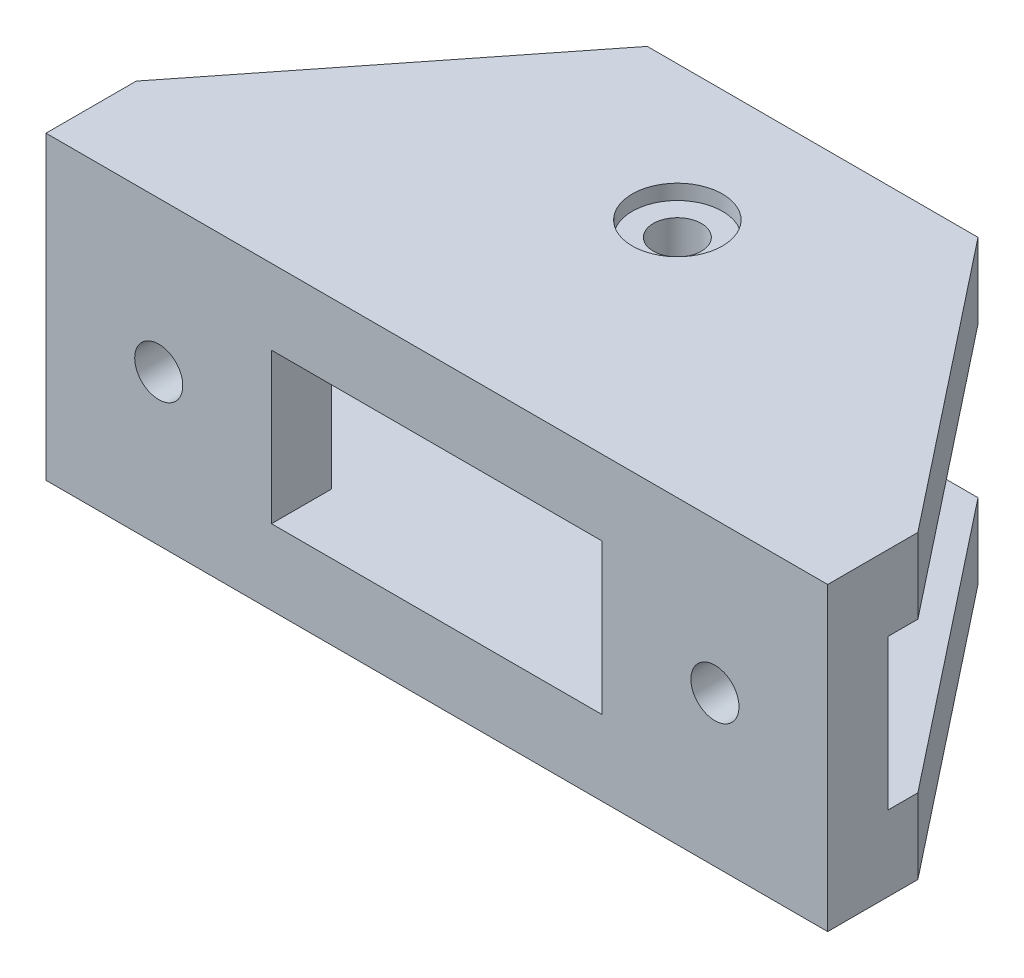
ISO-10303-21;
HEADER;
FILE_DESCRIPTION(('STEP AP214'),'2;1');
FILE_NAME('part.step','',(''),(''),'','','');
FILE_SCHEMA(('AUTOMOTIVE_DESIGN { 1 0 10303 214 1 1 1 1 }'));
ENDSEC;
DATA;
#1=APPLICATION_CONTEXT('core data for automotive mechanical design processes');
#2=APPLICATION_PROTOCOL_DEFINITION('international standard','automotive_design',2000,#1);
#3=PRODUCT_CONTEXT('',#1,'mechanical');
#4=PRODUCT('Part','Part','',(#3));
#5=PRODUCT_RELATED_PRODUCT_CATEGORY('part','',(#4));
#6=PRODUCT_DEFINITION_FORMATION('','',#4);
#7=PRODUCT_DEFINITION_CONTEXT('part definition',#1,'design');
#8=PRODUCT_DEFINITION('design','',#6,#7);
#9=PRODUCT_DEFINITION_SHAPE('','',#8);
#10=(LENGTH_UNIT() NAMED_UNIT(*) SI_UNIT(.MILLI.,.METRE.));
#11=(NAMED_UNIT(*) PLANE_ANGLE_UNIT() SI_UNIT($,.RADIAN.));
#12=(NAMED_UNIT(*) SI_UNIT($,.STERADIAN.) SOLID_ANGLE_UNIT());
#13=UNCERTAINTY_MEASURE_WITH_UNIT(LENGTH_MEASURE(1.E-05),#10,'distance_accuracy_value','');
#14=(GEOMETRIC_REPRESENTATION_CONTEXT(3) GLOBAL_UNCERTAINTY_ASSIGNED_CONTEXT((#13)) GLOBAL_UNIT_ASSIGNED_CONTEXT((#10,
#11,#12)) REPRESENTATION_CONTEXT('',''));
#15=CARTESIAN_POINT('',(0.,0.,0.));
#16=DIRECTION('',(0.,0.,1.));
#17=DIRECTION('',(1.,0.,0.));
#18=AXIS2_PLACEMENT_3D('',#15,#16,#17);
#19=CARTESIAN_POINT('',(514.530256366169,120.470120326647,9.));
#20=DIRECTION('',(0.,1.,0.));
#21=DIRECTION('',(0.,0.,1.));
#22=AXIS2_PLACEMENT_3D('',#19,#20,#21);
#23=CYLINDRICAL_SURFACE('',#22,1.60000000000002);
#24=CARTESIAN_POINT('',(514.530256366169,135.470120326647,9.));
#25=DIRECTION('',(0.,1.,0.));
#26=DIRECTION('',(0.,0.,1.));
#27=AXIS2_PLACEMENT_3D('',#24,#25,#26);
#28=CIRCLE('',#27,1.60000000000002);
#29=CARTESIAN_POINT('',(514.530256366169,135.470120326647,10.6));
#30=VERTEX_POINT('',#29);
#31=EDGE_CURVE('E351',#30,#30,#28,.T.);
#32=ORIENTED_EDGE('',*,*,#31,.F.);
#33=EDGE_LOOP('',(#32));
#34=FACE_BOUND('',#33,.T.);
#35=CARTESIAN_POINT('',(514.530256366169,139.470120326647,9.));
#36=DIRECTION('',(0.,1.,0.));
#37=DIRECTION('',(0.,0.,1.));
#38=AXIS2_PLACEMENT_3D('',#35,#36,#37);
#39=CIRCLE('',#38,1.60000000000002);
#40=CARTESIAN_POINT('',(514.530256366169,139.470120326647,10.6));
#41=VERTEX_POINT('',#40);
#42=EDGE_CURVE('E45',#41,#41,#39,.F.);
#43=ORIENTED_EDGE('',*,*,#42,.F.);
#44=EDGE_LOOP('',(#43));
#45=FACE_BOUND('',#44,.T.);
#46=ADVANCED_FACE('F41',(#34,#45),#23,.F.);
#47=CARTESIAN_POINT('',(533.030256366169,130.470120326647,25.));
#48=DIRECTION('',(0.,0.,-1.));
#49=DIRECTION('',(-1.,0.,0.));
#50=AXIS2_PLACEMENT_3D('',#47,#48,#49);
#51=CYLINDRICAL_SURFACE('',#50,1.60000000000002);
#52=CARTESIAN_POINT('',(533.030256366169,130.470120326647,25.));
#53=DIRECTION('',(0.,0.,-1.));
#54=DIRECTION('',(-1.,0.,0.));
#55=AXIS2_PLACEMENT_3D('',#52,#53,#54);
#56=CIRCLE('',#55,1.60000000000002);
#57=CARTESIAN_POINT('',(531.430256366169,130.470120326647,25.));
#58=VERTEX_POINT('',#57);
#59=EDGE_CURVE('E303',#58,#58,#56,.T.);
#60=ORIENTED_EDGE('',*,*,#59,.F.);
#61=EDGE_LOOP('',(#60));
#62=FACE_BOUND('',#61,.T.);
#63=CARTESIAN_POINT('',(533.030256366169,130.470120326647,22.));
#64=DIRECTION('',(0.,0.,-1.));
#65=DIRECTION('',(-1.,0.,0.));
#66=AXIS2_PLACEMENT_3D('',#63,#64,#65);
#67=CIRCLE('',#66,1.60000000000002);
#68=CARTESIAN_POINT('',(531.430256366169,130.470120326647,22.));
#69=VERTEX_POINT('',#68);
#70=EDGE_CURVE('E254',#69,#69,#67,.F.);
#71=ORIENTED_EDGE('',*,*,#70,.F.);
#72=EDGE_LOOP('',(#71));
#73=FACE_BOUND('',#72,.T.);
#74=ADVANCED_FACE('F486',(#62,#73),#51,.F.);
#75=CARTESIAN_POINT('',(496.030256366169,130.470120326647,25.));
#76=DIRECTION('',(0.,0.,-1.));
#77=DIRECTION('',(-1.,0.,0.));
#78=AXIS2_PLACEMENT_3D('',#75,#76,#77);
#79=CYLINDRICAL_SURFACE('',#78,1.59999999999996);
#80=CARTESIAN_POINT('',(496.030256366169,130.470120326647,25.));
#81=DIRECTION('',(0.,0.,-1.));
#82=DIRECTION('',(-1.,0.,0.));
#83=AXIS2_PLACEMENT_3D('',#80,#81,#82);
#84=CIRCLE('',#83,1.59999999999996);
#85=CARTESIAN_POINT('',(494.430256366169,130.470120326647,25.));
#86=VERTEX_POINT('',#85);
#87=EDGE_CURVE('E308',#86,#86,#84,.T.);
#88=ORIENTED_EDGE('',*,*,#87,.F.);
#89=EDGE_LOOP('',(#88));
#90=FACE_BOUND('',#89,.T.);
#91=CARTESIAN_POINT('',(496.030256366169,130.470120326647,22.));
#92=DIRECTION('',(0.,0.,-1.));
#93=DIRECTION('',(-1.,0.,0.));
#94=AXIS2_PLACEMENT_3D('',#91,#92,#93);
#95=CIRCLE('',#94,1.59999999999996);
#96=CARTESIAN_POINT('',(494.430256366169,130.470120326647,22.));
#97=VERTEX_POINT('',#96);
#98=EDGE_CURVE('E294',#97,#97,#95,.F.);
#99=ORIENTED_EDGE('',*,*,#98,.F.);
#100=EDGE_LOOP('',(#99));
#101=FACE_BOUND('',#100,.T.);
#102=ADVANCED_FACE('F488',(#90,#101),#79,.F.);
#103=CARTESIAN_POINT('',(488.530256366169,135.470120326647,21.));
#104=DIRECTION('',(0.,0.,1.));
#105=DIRECTION('',(1.,0.,0.));
#106=AXIS2_PLACEMENT_3D('',#103,#104,#105);
#107=PLANE('',#106);
#108=DIRECTION('',(-1.,0.,0.));
#109=VECTOR('',#108,1.);
#110=CARTESIAN_POINT('',(536.030256366169,126.970120326647,21.));
#111=LINE('',#110,#109);
#112=CARTESIAN_POINT('',(536.030256366169,126.970120326647,21.));
#113=VERTEX_POINT('',#112);
#114=CARTESIAN_POINT('',(530.030256366169,126.970120326647,21.));
#115=VERTEX_POINT('',#114);
#116=EDGE_CURVE('E245',#113,#115,#111,.T.);
#117=ORIENTED_EDGE('',*,*,#116,.F.);
#118=DIRECTION('',(0.,-1.,0.));
#119=VECTOR('',#118,1.);
#120=CARTESIAN_POINT('',(536.030256366169,133.970120326647,21.));
#121=LINE('',#120,#119);
#122=CARTESIAN_POINT('',(536.030256366169,133.970120326647,21.));
#123=VERTEX_POINT('',#122);
#124=EDGE_CURVE('E59',#123,#113,#121,.T.);
#125=ORIENTED_EDGE('',*,*,#124,.F.);
#126=DIRECTION('',(1.,0.,0.));
#127=VECTOR('',#126,1.);
#128=CARTESIAN_POINT('',(536.030256366169,133.970120326647,21.));
#129=LINE('',#128,#127);
#130=CARTESIAN_POINT('',(530.030256366169,133.970120326647,21.));
#131=VERTEX_POINT('',#130);
#132=EDGE_CURVE('E229',#131,#123,#129,.T.);
#133=ORIENTED_EDGE('',*,*,#132,.F.);
#134=DIRECTION('',(0.,1.,0.));
#135=VECTOR('',#134,1.);
#136=CARTESIAN_POINT('',(530.030256366169,133.970120326647,21.));
#137=LINE('',#136,#135);
#138=EDGE_CURVE('E233',#115,#131,#137,.T.);
#139=ORIENTED_EDGE('',*,*,#138,.F.);
#140=EDGE_LOOP('',(#117,#125,#133,#139));
#141=FACE_BOUND('',#140,.T.);
#142=DIRECTION('',(1.,0.,0.));
#143=VECTOR('',#142,1.);
#144=CARTESIAN_POINT('',(488.530256366169,125.470120326647,21.));
#145=LINE('',#144,#143);
#146=CARTESIAN_POINT('',(525.530256366169,125.470120326647,21.));
#147=VERTEX_POINT('',#146);
#148=CARTESIAN_POINT('',(540.530256366169,125.470120326647,21.));
#149=VERTEX_POINT('',#148);
#150=EDGE_CURVE('E429',#147,#149,#145,.T.);
#151=ORIENTED_EDGE('',*,*,#150,.F.);
#152=DIRECTION('',(0.,-1.,0.));
#153=VECTOR('',#152,1.);
#154=CARTESIAN_POINT('',(525.530256366169,135.470120326647,21.));
#155=LINE('',#154,#153);
#156=CARTESIAN_POINT('',(525.530256366169,135.470120326647,21.));
#157=VERTEX_POINT('',#156);
#158=EDGE_CURVE('E307',#157,#147,#155,.T.);
#159=ORIENTED_EDGE('',*,*,#158,.F.);
#160=DIRECTION('',(1.,0.,0.));
#161=VECTOR('',#160,1.);
#162=CARTESIAN_POINT('',(488.530256366169,135.470120326647,21.));
#163=LINE('',#162,#161);
#164=CARTESIAN_POINT('',(540.530256366169,135.470120326647,21.));
#165=VERTEX_POINT('',#164);
#166=EDGE_CURVE('E434',#157,#165,#163,.T.);
#167=ORIENTED_EDGE('',*,*,#166,.T.);
#168=DIRECTION('',(0.,-1.,0.));
#169=VECTOR('',#168,1.);
#170=CARTESIAN_POINT('',(540.530256366169,135.470120326647,21.));
#171=LINE('',#170,#169);
#172=EDGE_CURVE('E413',#165,#149,#171,.T.);
#173=ORIENTED_EDGE('',*,*,#172,.T.);
#174=EDGE_LOOP('',(#151,#159,#167,#173));
#175=FACE_BOUND('',#174,.T.);
#176=ADVANCED_FACE('F495',(#141,#175),#107,.F.);
#177=CARTESIAN_POINT('',(0.,0.,0.));
#178=DIRECTION('',(0.,0.,-1.));
#179=DIRECTION('',(-1.,0.,0.));
#180=AXIS2_PLACEMENT_3D('',#177,#178,#179);
#181=PLANE('',#180);
#182=DIRECTION('',(0.,1.,0.));
#183=VECTOR('',#182,1.);
#184=CARTESIAN_POINT('',(525.530256366169,120.470120326647,0.));
#185=LINE('',#184,#183);
#186=CARTESIAN_POINT('',(525.530256366169,120.470120326647,0.));
#187=VERTEX_POINT('',#186);
#188=CARTESIAN_POINT('',(525.530256366169,125.470120326647,0.));
#189=VERTEX_POINT('',#188);
#190=EDGE_CURVE('E377',#187,#189,#185,.T.);
#191=ORIENTED_EDGE('',*,*,#190,.F.);
#192=DIRECTION('',(1.,0.,0.));
#193=VECTOR('',#192,1.);
#194=CARTESIAN_POINT('',(540.530256366169,120.470120326647,0.));
#195=LINE('',#194,#193);
#196=CARTESIAN_POINT('',(503.530256366169,120.470120326647,0.));
#197=VERTEX_POINT('',#196);
#198=EDGE_CURVE('E443',#197,#187,#195,.T.);
#199=ORIENTED_EDGE('',*,*,#198,.F.);
#200=DIRECTION('',(0.,1.,0.));
#201=VECTOR('',#200,1.);
#202=CARTESIAN_POINT('',(503.530256366169,120.470120326647,0.));
#203=LINE('',#202,#201);
#204=CARTESIAN_POINT('',(503.530256366169,125.470120326647,0.));
#205=VERTEX_POINT('',#204);
#206=EDGE_CURVE('E381',#197,#205,#203,.T.);
#207=ORIENTED_EDGE('',*,*,#206,.T.);
#208=DIRECTION('',(1.,0.,0.));
#209=VECTOR('',#208,1.);
#210=CARTESIAN_POINT('',(488.530256366169,125.470120326647,0.));
#211=LINE('',#210,#209);
#212=EDGE_CURVE('E420',#205,#189,#211,.T.);
#213=ORIENTED_EDGE('',*,*,#212,.T.);
#214=EDGE_LOOP('',(#191,#199,#207,#213));
#215=FACE_BOUND('',#214,.T.);
#216=ADVANCED_FACE('F548',(#215),#181,.T.);
#217=CARTESIAN_POINT('',(540.530256366169,140.470120326647,25.));
#218=DIRECTION('',(-1.,0.,0.));
#219=DIRECTION('',(0.,0.,1.));
#220=AXIS2_PLACEMENT_3D('',#217,#218,#219);
#221=PLANE('',#220);
#222=DIRECTION('',(0.,0.,-1.));
#223=VECTOR('',#222,1.);
#224=CARTESIAN_POINT('',(540.530256366169,120.470120326647,25.));
#225=LINE('',#224,#223);
#226=CARTESIAN_POINT('',(540.530256366169,120.470120326647,25.));
#227=VERTEX_POINT('',#226);
#228=CARTESIAN_POINT('',(540.530256366169,120.470120326647,19.));
#229=VERTEX_POINT('',#228);
#230=EDGE_CURVE('E452',#227,#229,#225,.T.);
#231=ORIENTED_EDGE('',*,*,#230,.T.);
#232=DIRECTION('',(0.,1.,0.));
#233=VECTOR('',#232,1.);
#234=CARTESIAN_POINT('',(540.530256366169,120.470120326647,19.));
#235=LINE('',#234,#233);
#236=CARTESIAN_POINT('',(540.530256366169,125.470120326647,19.));
#237=VERTEX_POINT('',#236);
#238=EDGE_CURVE('E371',#229,#237,#235,.T.);
#239=ORIENTED_EDGE('',*,*,#238,.T.);
#240=DIRECTION('',(0.,0.,-1.));
#241=VECTOR('',#240,1.);
#242=CARTESIAN_POINT('',(540.530256366169,125.470120326647,0.));
#243=LINE('',#242,#241);
#244=EDGE_CURVE('E401',#149,#237,#243,.T.);
#245=ORIENTED_EDGE('',*,*,#244,.F.);
#246=ORIENTED_EDGE('',*,*,#172,.F.);
#247=DIRECTION('',(0.,0.,1.));
#248=VECTOR('',#247,1.);
#249=CARTESIAN_POINT('',(540.530256366169,135.470120326647,0.));
#250=LINE('',#249,#248);
#251=CARTESIAN_POINT('',(540.530256366169,135.470120326647,19.));
#252=VERTEX_POINT('',#251);
#253=EDGE_CURVE('E396',#252,#165,#250,.T.);
#254=ORIENTED_EDGE('',*,*,#253,.F.);
#255=CARTESIAN_POINT('',(540.530256366169,140.470120326647,19.));
#256=VERTEX_POINT('',#255);
#257=EDGE_CURVE('E376',#252,#256,#235,.T.);
#258=ORIENTED_EDGE('',*,*,#257,.T.);
#259=DIRECTION('',(0.,0.,-1.));
#260=VECTOR('',#259,1.);
#261=CARTESIAN_POINT('',(540.530256366169,140.470120326647,25.));
#262=LINE('',#261,#260);
#263=CARTESIAN_POINT('',(540.530256366169,140.470120326647,25.));
#264=VERTEX_POINT('',#263);
#265=EDGE_CURVE('E470',#264,#256,#262,.T.);
#266=ORIENTED_EDGE('',*,*,#265,.F.);
#267=DIRECTION('',(0.,1.,0.));
#268=VECTOR('',#267,1.);
#269=CARTESIAN_POINT('',(540.530256366169,140.470120326647,25.));
#270=LINE('',#269,#268);
#271=EDGE_CURVE('E438',#227,#264,#270,.T.);
#272=ORIENTED_EDGE('',*,*,#271,.F.);
#273=EDGE_LOOP('',(#231,#239,#245,#246,#254,#258,#266,#272));
#274=FACE_BOUND('',#273,.T.);
#275=ADVANCED_FACE('F43',(#274),#221,.F.);
#276=CARTESIAN_POINT('',(540.530256366169,140.470120326647,25.));
#277=DIRECTION('',(0.,-1.,0.));
#278=DIRECTION('',(0.,0.,-1.));
#279=AXIS2_PLACEMENT_3D('',#276,#277,#278);
#280=PLANE('',#279);
#281=CARTESIAN_POINT('',(514.530256366169,140.470120326647,9.));
#282=DIRECTION('',(0.,1.,0.));
#283=DIRECTION('',(0.,0.,1.));
#284=AXIS2_PLACEMENT_3D('',#281,#282,#283);
#285=CIRCLE('',#284,3.00000000000005);
#286=CARTESIAN_POINT('',(514.530256366169,140.470120326647,12.));
#287=VERTEX_POINT('',#286);
#288=EDGE_CURVE('E236',#287,#287,#285,.T.);
#289=ORIENTED_EDGE('',*,*,#288,.F.);
#290=EDGE_LOOP('',(#289));
#291=FACE_BOUND('',#290,.T.);
#292=ORIENTED_EDGE('',*,*,#265,.T.);
#293=DIRECTION('',(0.619644288579021,0.,0.784882765533426));
#294=VECTOR('',#293,1.);
#295=CARTESIAN_POINT('',(525.530256366169,140.470120326647,0.));
#296=LINE('',#295,#294);
#297=CARTESIAN_POINT('',(525.530256366169,140.470120326647,0.));
#298=VERTEX_POINT('',#297);
#299=EDGE_CURVE('E362',#298,#256,#296,.T.);
#300=ORIENTED_EDGE('',*,*,#299,.F.);
#301=DIRECTION('',(-1.,0.,0.));
#302=VECTOR('',#301,1.);
#303=CARTESIAN_POINT('',(540.530256366169,140.470120326647,0.));
#304=LINE('',#303,#302);
#305=CARTESIAN_POINT('',(503.530256366169,140.470120326647,0.));
#306=VERTEX_POINT('',#305);
#307=EDGE_CURVE('E424',#298,#306,#304,.T.);
#308=ORIENTED_EDGE('',*,*,#307,.T.);
#309=DIRECTION('',(0.61964428857902,0.,-0.784882765533427));
#310=VECTOR('',#309,1.);
#311=CARTESIAN_POINT('',(488.530256366169,140.470120326647,19.));
#312=LINE('',#311,#310);
#313=CARTESIAN_POINT('',(488.530256366169,140.470120326647,19.));
#314=VERTEX_POINT('',#313);
#315=EDGE_CURVE('E356',#314,#306,#312,.T.);
#316=ORIENTED_EDGE('',*,*,#315,.F.);
#317=DIRECTION('',(0.,0.,-1.));
#318=VECTOR('',#317,1.);
#319=CARTESIAN_POINT('',(488.530256366169,140.470120326647,25.));
#320=LINE('',#319,#318);
#321=CARTESIAN_POINT('',(488.530256366169,140.470120326647,25.));
#322=VERTEX_POINT('',#321);
#323=EDGE_CURVE('E466',#322,#314,#320,.T.);
#324=ORIENTED_EDGE('',*,*,#323,.F.);
#325=DIRECTION('',(-1.,0.,0.));
#326=VECTOR('',#325,1.);
#327=CARTESIAN_POINT('',(540.530256366169,140.470120326647,25.));
#328=LINE('',#327,#326);
#329=EDGE_CURVE('E442',#264,#322,#328,.T.);
#330=ORIENTED_EDGE('',*,*,#329,.F.);
#331=EDGE_LOOP('',(#292,#300,#308,#316,#324,#330));
#332=FACE_BOUND('',#331,.T.);
#333=ADVANCED_FACE('F554',(#291,#332),#280,.F.);
#334=CARTESIAN_POINT('',(488.530256366169,140.470120326647,25.));
#335=DIRECTION('',(1.,0.,0.));
#336=DIRECTION('',(0.,0.,-1.));
#337=AXIS2_PLACEMENT_3D('',#334,#335,#336);
#338=PLANE('',#337);
#339=ORIENTED_EDGE('',*,*,#323,.T.);
#340=DIRECTION('',(0.,1.,0.));
#341=VECTOR('',#340,1.);
#342=CARTESIAN_POINT('',(488.530256366169,120.470120326647,19.));
#343=LINE('',#342,#341);
#344=CARTESIAN_POINT('',(488.530256366169,135.470120326647,19.));
#345=VERTEX_POINT('',#344);
#346=EDGE_CURVE('E366',#345,#314,#343,.T.);
#347=ORIENTED_EDGE('',*,*,#346,.F.);
#348=DIRECTION('',(0.,0.,1.));
#349=VECTOR('',#348,1.);
#350=CARTESIAN_POINT('',(488.530256366169,135.470120326647,0.));
#351=LINE('',#350,#349);
#352=CARTESIAN_POINT('',(488.530256366169,135.470120326647,21.));
#353=VERTEX_POINT('',#352);
#354=EDGE_CURVE('E397',#345,#353,#351,.T.);
#355=ORIENTED_EDGE('',*,*,#354,.T.);
#356=DIRECTION('',(0.,-1.,0.));
#357=VECTOR('',#356,1.);
#358=CARTESIAN_POINT('',(488.530256366169,135.470120326647,21.));
#359=LINE('',#358,#357);
#360=CARTESIAN_POINT('',(488.530256366169,125.470120326647,21.));
#361=VERTEX_POINT('',#360);
#362=EDGE_CURVE('E400',#353,#361,#359,.T.);
#363=ORIENTED_EDGE('',*,*,#362,.T.);
#364=DIRECTION('',(0.,0.,-1.));
#365=VECTOR('',#364,1.);
#366=CARTESIAN_POINT('',(488.530256366169,125.470120326647,0.));
#367=LINE('',#366,#365);
#368=CARTESIAN_POINT('',(488.530256366169,125.470120326647,19.));
#369=VERTEX_POINT('',#368);
#370=EDGE_CURVE('E405',#361,#369,#367,.T.);
#371=ORIENTED_EDGE('',*,*,#370,.T.);
#372=CARTESIAN_POINT('',(488.530256366169,120.470120326647,19.));
#373=VERTEX_POINT('',#372);
#374=EDGE_CURVE('E386',#373,#369,#343,.T.);
#375=ORIENTED_EDGE('',*,*,#374,.F.);
#376=DIRECTION('',(0.,0.,-1.));
#377=VECTOR('',#376,1.);
#378=CARTESIAN_POINT('',(488.530256366169,120.470120326647,25.));
#379=LINE('',#378,#377);
#380=CARTESIAN_POINT('',(488.530256366169,120.470120326647,25.));
#381=VERTEX_POINT('',#380);
#382=EDGE_CURVE('E462',#381,#373,#379,.T.);
#383=ORIENTED_EDGE('',*,*,#382,.F.);
#384=DIRECTION('',(0.,-1.,0.));
#385=VECTOR('',#384,1.);
#386=CARTESIAN_POINT('',(488.530256366169,140.470120326647,25.));
#387=LINE('',#386,#385);
#388=EDGE_CURVE('E446',#322,#381,#387,.T.);
#389=ORIENTED_EDGE('',*,*,#388,.F.);
#390=EDGE_LOOP('',(#339,#347,#355,#363,#371,#375,#383,#389));
#391=FACE_BOUND('',#390,.T.);
#392=ADVANCED_FACE('F551',(#391),#338,.F.);
#393=CARTESIAN_POINT('',(540.530256366169,120.470120326647,25.));
#394=DIRECTION('',(0.,1.,0.));
#395=DIRECTION('',(-1.,0.,0.));
#396=AXIS2_PLACEMENT_3D('',#393,#394,#395);
#397=PLANE('',#396);
#398=CARTESIAN_POINT('',(514.530256366169,120.470120326647,9.));
#399=DIRECTION('',(0.,1.,0.));
#400=DIRECTION('',(0.,0.,1.));
#401=AXIS2_PLACEMENT_3D('',#398,#399,#400);
#402=CIRCLE('',#401,1.60000000000002);
#403=CARTESIAN_POINT('',(514.530256366169,120.470120326647,10.6));
#404=VERTEX_POINT('',#403);
#405=EDGE_CURVE('E338',#404,#404,#402,.T.);
#406=ORIENTED_EDGE('',*,*,#405,.T.);
#407=EDGE_LOOP('',(#406));
#408=FACE_BOUND('',#407,.T.);
#409=ORIENTED_EDGE('',*,*,#198,.T.);
#410=DIRECTION('',(0.619644288579021,0.,0.784882765533426));
#411=VECTOR('',#410,1.);
#412=CARTESIAN_POINT('',(525.530256366169,120.470120326647,0.));
#413=LINE('',#412,#411);
#414=EDGE_CURVE('E361',#187,#229,#413,.T.);
#415=ORIENTED_EDGE('',*,*,#414,.T.);
#416=ORIENTED_EDGE('',*,*,#230,.F.);
#417=DIRECTION('',(1.,0.,0.));
#418=VECTOR('',#417,1.);
#419=CARTESIAN_POINT('',(540.530256366169,120.470120326647,25.));
#420=LINE('',#419,#418);
#421=EDGE_CURVE('E449',#381,#227,#420,.T.);
#422=ORIENTED_EDGE('',*,*,#421,.F.);
#423=ORIENTED_EDGE('',*,*,#382,.T.);
#424=DIRECTION('',(0.61964428857902,0.,-0.784882765533427));
#425=VECTOR('',#424,1.);
#426=CARTESIAN_POINT('',(488.530256366169,120.470120326647,19.));
#427=LINE('',#426,#425);
#428=EDGE_CURVE('E357',#373,#197,#427,.T.);
#429=ORIENTED_EDGE('',*,*,#428,.T.);
#430=EDGE_LOOP('',(#409,#415,#416,#422,#423,#429));
#431=FACE_BOUND('',#430,.T.);
#432=ADVANCED_FACE('F543',(#408,#431),#397,.F.);
#433=CARTESIAN_POINT('',(0.,0.,25.));
#434=DIRECTION('',(0.,0.,-1.));
#435=DIRECTION('',(-1.,0.,0.));
#436=AXIS2_PLACEMENT_3D('',#433,#434,#435);
#437=PLANE('',#436);
#438=ORIENTED_EDGE('',*,*,#59,.T.);
#439=EDGE_LOOP('',(#438));
#440=FACE_BOUND('',#439,.T.);
#441=ORIENTED_EDGE('',*,*,#87,.T.);
#442=EDGE_LOOP('',(#441));
#443=FACE_BOUND('',#442,.T.);
#444=DIRECTION('',(1.,0.,0.));
#445=VECTOR('',#444,1.);
#446=CARTESIAN_POINT('',(525.530256366169,135.470120326647,25.));
#447=LINE('',#446,#445);
#448=CARTESIAN_POINT('',(503.530256366169,135.470120326647,25.));
#449=VERTEX_POINT('',#448);
#450=CARTESIAN_POINT('',(525.530256366169,135.470120326647,25.));
#451=VERTEX_POINT('',#450);
#452=EDGE_CURVE('E325',#449,#451,#447,.T.);
#453=ORIENTED_EDGE('',*,*,#452,.T.);
#454=DIRECTION('',(0.,-1.,0.));
#455=VECTOR('',#454,1.);
#456=CARTESIAN_POINT('',(525.530256366169,135.470120326647,25.));
#457=LINE('',#456,#455);
#458=CARTESIAN_POINT('',(525.530256366169,125.470120326647,25.));
#459=VERTEX_POINT('',#458);
#460=EDGE_CURVE('E312',#451,#459,#457,.T.);
#461=ORIENTED_EDGE('',*,*,#460,.T.);
#462=DIRECTION('',(-1.,0.,0.));
#463=VECTOR('',#462,1.);
#464=CARTESIAN_POINT('',(525.530256366169,125.470120326647,25.));
#465=LINE('',#464,#463);
#466=CARTESIAN_POINT('',(503.530256366169,125.470120326647,25.));
#467=VERTEX_POINT('',#466);
#468=EDGE_CURVE('E316',#459,#467,#465,.T.);
#469=ORIENTED_EDGE('',*,*,#468,.T.);
#470=DIRECTION('',(0.,1.,0.));
#471=VECTOR('',#470,1.);
#472=CARTESIAN_POINT('',(503.530256366169,135.470120326647,25.));
#473=LINE('',#472,#471);
#474=EDGE_CURVE('E321',#467,#449,#473,.T.);
#475=ORIENTED_EDGE('',*,*,#474,.T.);
#476=EDGE_LOOP('',(#453,#461,#469,#475));
#477=FACE_BOUND('',#476,.T.);
#478=ORIENTED_EDGE('',*,*,#271,.T.);
#479=ORIENTED_EDGE('',*,*,#329,.T.);
#480=ORIENTED_EDGE('',*,*,#388,.T.);
#481=ORIENTED_EDGE('',*,*,#421,.T.);
#482=EDGE_LOOP('',(#478,#479,#480,#481));
#483=FACE_BOUND('',#482,.T.);
#484=ADVANCED_FACE('F540',(#440,#443,#477,#483),#437,.F.);
#485=CARTESIAN_POINT('',(525.530256366169,135.470120326647,0.));
#486=VERTEX_POINT('',#485);
#487=EDGE_CURVE('E380',#486,#298,#185,.T.);
#488=ORIENTED_EDGE('',*,*,#487,.F.);
#489=DIRECTION('',(1.,0.,0.));
#490=VECTOR('',#489,1.);
#491=CARTESIAN_POINT('',(488.530256366169,135.470120326647,0.));
#492=LINE('',#491,#490);
#493=CARTESIAN_POINT('',(503.530256366169,135.470120326647,0.));
#494=VERTEX_POINT('',#493);
#495=EDGE_CURVE('E409',#494,#486,#492,.T.);
#496=ORIENTED_EDGE('',*,*,#495,.F.);
#497=EDGE_CURVE('E385',#494,#306,#203,.T.);
#498=ORIENTED_EDGE('',*,*,#497,.T.);
#499=ORIENTED_EDGE('',*,*,#307,.F.);
#500=EDGE_LOOP('',(#488,#496,#498,#499));
#501=FACE_BOUND('',#500,.T.);
#502=ADVANCED_FACE('F531',(#501),#181,.T.);
#503=CARTESIAN_POINT('',(488.530256366169,125.470120326647,0.));
#504=DIRECTION('',(0.,-1.,0.));
#505=DIRECTION('',(0.,0.,-1.));
#506=AXIS2_PLACEMENT_3D('',#503,#504,#505);
#507=PLANE('',#506);
#508=CARTESIAN_POINT('',(514.530256366169,125.470120326647,9.));
#509=DIRECTION('',(0.,-1.,0.));
#510=DIRECTION('',(0.,0.,-1.));
#511=AXIS2_PLACEMENT_3D('',#508,#509,#510);
#512=CIRCLE('',#511,1.60000000000002);
#513=CARTESIAN_POINT('',(514.530256366169,125.470120326647,7.39999999999997));
#514=VERTEX_POINT('',#513);
#515=EDGE_CURVE('E352',#514,#514,#512,.T.);
#516=ORIENTED_EDGE('',*,*,#515,.T.);
#517=EDGE_LOOP('',(#516));
#518=FACE_BOUND('',#517,.T.);
#519=ORIENTED_EDGE('',*,*,#244,.T.);
#520=DIRECTION('',(-0.619644288579021,0.,-0.784882765533426));
#521=VECTOR('',#520,1.);
#522=CARTESIAN_POINT('',(511.323771724531,125.470120326647,-17.9948805460751));
#523=LINE('',#522,#521);
#524=EDGE_CURVE('E392',#237,#189,#523,.T.);
#525=ORIENTED_EDGE('',*,*,#524,.T.);
#526=ORIENTED_EDGE('',*,*,#212,.F.);
#527=DIRECTION('',(-0.61964428857902,0.,0.784882765533427));
#528=VECTOR('',#527,1.);
#529=CARTESIAN_POINT('',(497.77087070064,125.470120326647,7.29522184300338));
#530=LINE('',#529,#528);
#531=EDGE_CURVE('E375',#205,#369,#530,.T.);
#532=ORIENTED_EDGE('',*,*,#531,.T.);
#533=ORIENTED_EDGE('',*,*,#370,.F.);
#534=CARTESIAN_POINT('',(503.530256366169,125.470120326647,21.));
#535=VERTEX_POINT('',#534);
#536=EDGE_CURVE('E425',#361,#535,#145,.T.);
#537=ORIENTED_EDGE('',*,*,#536,.T.);
#538=DIRECTION('',(0.,0.,-1.));
#539=VECTOR('',#538,1.);
#540=CARTESIAN_POINT('',(503.530256366169,125.470120326647,25.));
#541=LINE('',#540,#539);
#542=EDGE_CURVE('E343',#467,#535,#541,.T.);
#543=ORIENTED_EDGE('',*,*,#542,.F.);
#544=ORIENTED_EDGE('',*,*,#468,.F.);
#545=DIRECTION('',(0.,0.,-1.));
#546=VECTOR('',#545,1.);
#547=CARTESIAN_POINT('',(525.530256366169,125.470120326647,25.));
#548=LINE('',#547,#546);
#549=EDGE_CURVE('E329',#459,#147,#548,.T.);
#550=ORIENTED_EDGE('',*,*,#549,.T.);
#551=ORIENTED_EDGE('',*,*,#150,.T.);
#552=EDGE_LOOP('',(#519,#525,#526,#532,#533,#537,#543,#544,#550,#551));
#553=FACE_BOUND('',#552,.T.);
#554=ADVANCED_FACE('F527',(#518,#553),#507,.F.);
#555=DIRECTION('',(-1.,0.,0.));
#556=VECTOR('',#555,1.);
#557=CARTESIAN_POINT('',(499.030256366169,126.970120326647,21.));
#558=LINE('',#557,#556);
#559=CARTESIAN_POINT('',(499.030256366169,126.970120326647,21.));
#560=VERTEX_POINT('',#559);
#561=CARTESIAN_POINT('',(493.030256366169,126.970120326647,21.));
#562=VERTEX_POINT('',#561);
#563=EDGE_CURVE('E280',#560,#562,#558,.T.);
#564=ORIENTED_EDGE('',*,*,#563,.F.);
#565=DIRECTION('',(0.,-1.,0.));
#566=VECTOR('',#565,1.);
#567=CARTESIAN_POINT('',(499.030256366169,133.970120326647,21.));
#568=LINE('',#567,#566);
#569=CARTESIAN_POINT('',(499.030256366169,133.970120326647,21.));
#570=VERTEX_POINT('',#569);
#571=EDGE_CURVE('E67',#570,#560,#568,.T.);
#572=ORIENTED_EDGE('',*,*,#571,.F.);
#573=DIRECTION('',(1.,0.,0.));
#574=VECTOR('',#573,1.);
#575=CARTESIAN_POINT('',(499.030256366169,133.970120326647,21.));
#576=LINE('',#575,#574);
#577=CARTESIAN_POINT('',(493.030256366169,133.970120326647,21.));
#578=VERTEX_POINT('',#577);
#579=EDGE_CURVE('E265',#578,#570,#576,.T.);
#580=ORIENTED_EDGE('',*,*,#579,.F.);
#581=DIRECTION('',(0.,1.,0.));
#582=VECTOR('',#581,1.);
#583=CARTESIAN_POINT('',(493.030256366169,133.970120326647,21.));
#584=LINE('',#583,#582);
#585=EDGE_CURVE('E284',#562,#578,#584,.T.);
#586=ORIENTED_EDGE('',*,*,#585,.F.);
#587=EDGE_LOOP('',(#564,#572,#580,#586));
#588=FACE_BOUND('',#587,.T.);
#589=CARTESIAN_POINT('',(503.530256366169,135.470120326647,21.));
#590=VERTEX_POINT('',#589);
#591=EDGE_CURVE('E430',#353,#590,#163,.T.);
#592=ORIENTED_EDGE('',*,*,#591,.T.);
#593=DIRECTION('',(0.,1.,0.));
#594=VECTOR('',#593,1.);
#595=CARTESIAN_POINT('',(503.530256366169,135.470120326647,21.));
#596=LINE('',#595,#594);
#597=EDGE_CURVE('E317',#535,#590,#596,.T.);
#598=ORIENTED_EDGE('',*,*,#597,.F.);
#599=ORIENTED_EDGE('',*,*,#536,.F.);
#600=ORIENTED_EDGE('',*,*,#362,.F.);
#601=EDGE_LOOP('',(#592,#598,#599,#600));
#602=FACE_BOUND('',#601,.T.);
#603=ADVANCED_FACE('F530',(#588,#602),#107,.F.);
#604=CARTESIAN_POINT('',(488.530256366169,135.470120326647,0.));
#605=DIRECTION('',(0.,1.,0.));
#606=DIRECTION('',(0.,0.,1.));
#607=AXIS2_PLACEMENT_3D('',#604,#605,#606);
#608=PLANE('',#607);
#609=ORIENTED_EDGE('',*,*,#31,.T.);
#610=EDGE_LOOP('',(#609));
#611=FACE_BOUND('',#610,.T.);
#612=ORIENTED_EDGE('',*,*,#495,.T.);
#613=DIRECTION('',(0.619644288579021,0.,0.784882765533426));
#614=VECTOR('',#613,1.);
#615=CARTESIAN_POINT('',(511.323771724531,135.470120326647,-17.9948805460751));
#616=LINE('',#615,#614);
#617=EDGE_CURVE('E11',#486,#252,#616,.T.);
#618=ORIENTED_EDGE('',*,*,#617,.T.);
#619=ORIENTED_EDGE('',*,*,#253,.T.);
#620=ORIENTED_EDGE('',*,*,#166,.F.);
#621=DIRECTION('',(0.,0.,-1.));
#622=VECTOR('',#621,1.);
#623=CARTESIAN_POINT('',(525.530256366169,135.470120326647,25.));
#624=LINE('',#623,#622);
#625=EDGE_CURVE('E335',#451,#157,#624,.T.);
#626=ORIENTED_EDGE('',*,*,#625,.F.);
#627=ORIENTED_EDGE('',*,*,#452,.F.);
#628=DIRECTION('',(0.,0.,-1.));
#629=VECTOR('',#628,1.);
#630=CARTESIAN_POINT('',(503.530256366169,135.470120326647,25.));
#631=LINE('',#630,#629);
#632=EDGE_CURVE('E339',#449,#590,#631,.T.);
#633=ORIENTED_EDGE('',*,*,#632,.T.);
#634=ORIENTED_EDGE('',*,*,#591,.F.);
#635=ORIENTED_EDGE('',*,*,#354,.F.);
#636=DIRECTION('',(0.61964428857902,0.,-0.784882765533427));
#637=VECTOR('',#636,1.);
#638=CARTESIAN_POINT('',(497.77087070064,135.470120326647,7.29522184300339));
#639=LINE('',#638,#637);
#640=EDGE_CURVE('E51',#345,#494,#639,.T.);
#641=ORIENTED_EDGE('',*,*,#640,.T.);
#642=EDGE_LOOP('',(#612,#618,#619,#620,#626,#627,#633,#634,#635,#641));
#643=FACE_BOUND('',#642,.T.);
#644=ADVANCED_FACE('F535',(#611,#643),#608,.F.);
#645=CARTESIAN_POINT('',(488.530256366169,120.470120326647,19.));
#646=DIRECTION('',(0.784882765533427,0.,0.61964428857902));
#647=DIRECTION('',(0.61964428857902,0.,-0.784882765533427));
#648=AXIS2_PLACEMENT_3D('',#645,#646,#647);
#649=PLANE('',#648);
#650=ORIENTED_EDGE('',*,*,#346,.T.);
#651=ORIENTED_EDGE('',*,*,#315,.T.);
#652=ORIENTED_EDGE('',*,*,#497,.F.);
#653=ORIENTED_EDGE('',*,*,#640,.F.);
#654=EDGE_LOOP('',(#650,#651,#652,#653));
#655=FACE_BOUND('',#654,.T.);
#656=ADVANCED_FACE('F526',(#655),#649,.F.);
#657=CARTESIAN_POINT('',(525.530256366169,120.470120326647,0.));
#658=DIRECTION('',(-0.784882765533426,0.,0.619644288579021));
#659=DIRECTION('',(0.619644288579021,0.,0.784882765533426));
#660=AXIS2_PLACEMENT_3D('',#657,#658,#659);
#661=PLANE('',#660);
#662=ORIENTED_EDGE('',*,*,#487,.T.);
#663=ORIENTED_EDGE('',*,*,#299,.T.);
#664=ORIENTED_EDGE('',*,*,#257,.F.);
#665=ORIENTED_EDGE('',*,*,#617,.F.);
#666=EDGE_LOOP('',(#662,#663,#664,#665));
#667=FACE_BOUND('',#666,.T.);
#668=ADVANCED_FACE('F522',(#667),#661,.F.);
#669=ORIENTED_EDGE('',*,*,#206,.F.);
#670=ORIENTED_EDGE('',*,*,#428,.F.);
#671=ORIENTED_EDGE('',*,*,#374,.T.);
#672=ORIENTED_EDGE('',*,*,#531,.F.);
#673=EDGE_LOOP('',(#669,#670,#671,#672));
#674=FACE_BOUND('',#673,.T.);
#675=ADVANCED_FACE('F520',(#674),#649,.F.);
#676=ORIENTED_EDGE('',*,*,#238,.F.);
#677=ORIENTED_EDGE('',*,*,#414,.F.);
#678=ORIENTED_EDGE('',*,*,#190,.T.);
#679=ORIENTED_EDGE('',*,*,#524,.F.);
#680=EDGE_LOOP('',(#676,#677,#678,#679));
#681=FACE_BOUND('',#680,.T.);
#682=ADVANCED_FACE('F516',(#681),#661,.F.);
#683=ORIENTED_EDGE('',*,*,#405,.F.);
#684=EDGE_LOOP('',(#683));
#685=FACE_BOUND('',#684,.T.);
#686=ORIENTED_EDGE('',*,*,#515,.F.);
#687=EDGE_LOOP('',(#686));
#688=FACE_BOUND('',#687,.T.);
#689=ADVANCED_FACE('F500',(#685,#688),#23,.F.);
#690=CARTESIAN_POINT('',(525.530256366169,135.470120326647,25.));
#691=DIRECTION('',(1.,0.,0.));
#692=DIRECTION('',(0.,0.,-1.));
#693=AXIS2_PLACEMENT_3D('',#690,#691,#692);
#694=PLANE('',#693);
#695=ORIENTED_EDGE('',*,*,#158,.T.);
#696=ORIENTED_EDGE('',*,*,#549,.F.);
#697=ORIENTED_EDGE('',*,*,#460,.F.);
#698=ORIENTED_EDGE('',*,*,#625,.T.);
#699=EDGE_LOOP('',(#695,#696,#697,#698));
#700=FACE_BOUND('',#699,.T.);
#701=ADVANCED_FACE('F510',(#700),#694,.F.);
#702=CARTESIAN_POINT('',(503.530256366169,135.470120326647,25.));
#703=DIRECTION('',(-1.,0.,0.));
#704=DIRECTION('',(0.,0.,1.));
#705=AXIS2_PLACEMENT_3D('',#702,#703,#704);
#706=PLANE('',#705);
#707=ORIENTED_EDGE('',*,*,#597,.T.);
#708=ORIENTED_EDGE('',*,*,#632,.F.);
#709=ORIENTED_EDGE('',*,*,#474,.F.);
#710=ORIENTED_EDGE('',*,*,#542,.T.);
#711=EDGE_LOOP('',(#707,#708,#709,#710));
#712=FACE_BOUND('',#711,.T.);
#713=ADVANCED_FACE('F506',(#712),#706,.F.);
#714=CARTESIAN_POINT('',(0.,0.,22.));
#715=DIRECTION('',(0.,0.,-1.));
#716=DIRECTION('',(-1.,0.,0.));
#717=AXIS2_PLACEMENT_3D('',#714,#715,#716);
#718=PLANE('',#717);
#719=DIRECTION('',(0.,-1.,0.));
#720=VECTOR('',#719,1.);
#721=CARTESIAN_POINT('',(499.030256366169,133.970120326647,22.));
#722=LINE('',#721,#720);
#723=CARTESIAN_POINT('',(499.030256366169,133.970120326647,22.));
#724=VERTEX_POINT('',#723);
#725=CARTESIAN_POINT('',(499.030256366169,126.970120326647,22.));
#726=VERTEX_POINT('',#725);
#727=EDGE_CURVE('E260',#724,#726,#722,.T.);
#728=ORIENTED_EDGE('',*,*,#727,.T.);
#729=DIRECTION('',(-1.,0.,0.));
#730=VECTOR('',#729,1.);
#731=CARTESIAN_POINT('',(499.030256366169,126.970120326647,22.));
#732=LINE('',#731,#730);
#733=CARTESIAN_POINT('',(493.030256366169,126.970120326647,22.));
#734=VERTEX_POINT('',#733);
#735=EDGE_CURVE('E264',#726,#734,#732,.T.);
#736=ORIENTED_EDGE('',*,*,#735,.T.);
#737=DIRECTION('',(0.,1.,0.));
#738=VECTOR('',#737,1.);
#739=CARTESIAN_POINT('',(493.030256366169,133.970120326647,22.));
#740=LINE('',#739,#738);
#741=CARTESIAN_POINT('',(493.030256366169,133.970120326647,22.));
#742=VERTEX_POINT('',#741);
#743=EDGE_CURVE('E269',#734,#742,#740,.T.);
#744=ORIENTED_EDGE('',*,*,#743,.T.);
#745=DIRECTION('',(1.,0.,0.));
#746=VECTOR('',#745,1.);
#747=CARTESIAN_POINT('',(499.030256366169,133.970120326647,22.));
#748=LINE('',#747,#746);
#749=EDGE_CURVE('E273',#742,#724,#748,.T.);
#750=ORIENTED_EDGE('',*,*,#749,.T.);
#751=EDGE_LOOP('',(#728,#736,#744,#750));
#752=FACE_BOUND('',#751,.T.);
#753=ORIENTED_EDGE('',*,*,#98,.T.);
#754=EDGE_LOOP('',(#753));
#755=FACE_BOUND('',#754,.T.);
#756=ADVANCED_FACE('F509',(#752,#755),#718,.T.);
#757=CARTESIAN_POINT('',(499.030256366169,133.970120326647,22.));
#758=DIRECTION('',(1.,0.,0.));
#759=DIRECTION('',(0.,0.,-1.));
#760=AXIS2_PLACEMENT_3D('',#757,#758,#759);
#761=PLANE('',#760);
#762=ORIENTED_EDGE('',*,*,#571,.T.);
#763=DIRECTION('',(0.,0.,-1.));
#764=VECTOR('',#763,1.);
#765=CARTESIAN_POINT('',(499.030256366169,126.970120326647,22.));
#766=LINE('',#765,#764);
#767=EDGE_CURVE('E277',#726,#560,#766,.T.);
#768=ORIENTED_EDGE('',*,*,#767,.F.);
#769=ORIENTED_EDGE('',*,*,#727,.F.);
#770=DIRECTION('',(0.,0.,-1.));
#771=VECTOR('',#770,1.);
#772=CARTESIAN_POINT('',(499.030256366169,133.970120326647,22.));
#773=LINE('',#772,#771);
#774=EDGE_CURVE('E291',#724,#570,#773,.T.);
#775=ORIENTED_EDGE('',*,*,#774,.T.);
#776=EDGE_LOOP('',(#762,#768,#769,#775));
#777=FACE_BOUND('',#776,.T.);
#778=ADVANCED_FACE('F503',(#777),#761,.F.);
#779=CARTESIAN_POINT('',(499.030256366169,133.970120326647,22.));
#780=DIRECTION('',(0.,1.,0.));
#781=DIRECTION('',(0.,0.,1.));
#782=AXIS2_PLACEMENT_3D('',#779,#780,#781);
#783=PLANE('',#782);
#784=ORIENTED_EDGE('',*,*,#579,.T.);
#785=ORIENTED_EDGE('',*,*,#774,.F.);
#786=ORIENTED_EDGE('',*,*,#749,.F.);
#787=DIRECTION('',(0.,0.,-1.));
#788=VECTOR('',#787,1.);
#789=CARTESIAN_POINT('',(493.030256366169,133.970120326647,22.));
#790=LINE('',#789,#788);
#791=EDGE_CURVE('E295',#742,#578,#790,.T.);
#792=ORIENTED_EDGE('',*,*,#791,.T.);
#793=EDGE_LOOP('',(#784,#785,#786,#792));
#794=FACE_BOUND('',#793,.T.);
#795=ADVANCED_FACE('F642',(#794),#783,.F.);
#796=CARTESIAN_POINT('',(493.030256366169,133.970120326647,22.));
#797=DIRECTION('',(-1.,0.,0.));
#798=DIRECTION('',(0.,0.,1.));
#799=AXIS2_PLACEMENT_3D('',#796,#797,#798);
#800=PLANE('',#799);
#801=ORIENTED_EDGE('',*,*,#585,.T.);
#802=ORIENTED_EDGE('',*,*,#791,.F.);
#803=ORIENTED_EDGE('',*,*,#743,.F.);
#804=DIRECTION('',(0.,0.,-1.));
#805=VECTOR('',#804,1.);
#806=CARTESIAN_POINT('',(493.030256366169,126.970120326647,22.));
#807=LINE('',#806,#805);
#808=EDGE_CURVE('E298',#734,#562,#807,.T.);
#809=ORIENTED_EDGE('',*,*,#808,.T.);
#810=EDGE_LOOP('',(#801,#802,#803,#809));
#811=FACE_BOUND('',#810,.T.);
#812=ADVANCED_FACE('F645',(#811),#800,.F.);
#813=CARTESIAN_POINT('',(499.030256366169,126.970120326647,22.));
#814=DIRECTION('',(0.,-1.,0.));
#815=DIRECTION('',(0.,0.,-1.));
#816=AXIS2_PLACEMENT_3D('',#813,#814,#815);
#817=PLANE('',#816);
#818=ORIENTED_EDGE('',*,*,#563,.T.);
#819=ORIENTED_EDGE('',*,*,#808,.F.);
#820=ORIENTED_EDGE('',*,*,#735,.F.);
#821=ORIENTED_EDGE('',*,*,#767,.T.);
#822=EDGE_LOOP('',(#818,#819,#820,#821));
#823=FACE_BOUND('',#822,.T.);
#824=ADVANCED_FACE('F648',(#823),#817,.F.);
#825=CARTESIAN_POINT('',(0.,0.,22.));
#826=DIRECTION('',(0.,0.,-1.));
#827=DIRECTION('',(-1.,0.,0.));
#828=AXIS2_PLACEMENT_3D('',#825,#826,#827);
#829=PLANE('',#828);
#830=DIRECTION('',(0.,-1.,0.));
#831=VECTOR('',#830,1.);
#832=CARTESIAN_POINT('',(536.030256366169,133.970120326647,22.));
#833=LINE('',#832,#831);
#834=CARTESIAN_POINT('',(536.030256366169,133.970120326647,22.));
#835=VERTEX_POINT('',#834);
#836=CARTESIAN_POINT('',(536.030256366169,126.970120326647,22.));
#837=VERTEX_POINT('',#836);
#838=EDGE_CURVE('E207',#835,#837,#833,.T.);
#839=ORIENTED_EDGE('',*,*,#838,.T.);
#840=DIRECTION('',(-1.,0.,0.));
#841=VECTOR('',#840,1.);
#842=CARTESIAN_POINT('',(536.030256366169,126.970120326647,22.));
#843=LINE('',#842,#841);
#844=CARTESIAN_POINT('',(530.030256366169,126.970120326647,22.));
#845=VERTEX_POINT('',#844);
#846=EDGE_CURVE('E217',#837,#845,#843,.T.);
#847=ORIENTED_EDGE('',*,*,#846,.T.);
#848=DIRECTION('',(0.,1.,0.));
#849=VECTOR('',#848,1.);
#850=CARTESIAN_POINT('',(530.030256366169,133.970120326647,22.));
#851=LINE('',#850,#849);
#852=CARTESIAN_POINT('',(530.030256366169,133.970120326647,22.));
#853=VERTEX_POINT('',#852);
#854=EDGE_CURVE('E223',#845,#853,#851,.T.);
#855=ORIENTED_EDGE('',*,*,#854,.T.);
#856=DIRECTION('',(1.,0.,0.));
#857=VECTOR('',#856,1.);
#858=CARTESIAN_POINT('',(536.030256366169,133.970120326647,22.));
#859=LINE('',#858,#857);
#860=EDGE_CURVE('E214',#853,#835,#859,.T.);
#861=ORIENTED_EDGE('',*,*,#860,.T.);
#862=EDGE_LOOP('',(#839,#847,#855,#861));
#863=FACE_BOUND('',#862,.T.);
#864=ORIENTED_EDGE('',*,*,#70,.T.);
#865=EDGE_LOOP('',(#864));
#866=FACE_BOUND('',#865,.T.);
#867=ADVANCED_FACE('F225',(#863,#866),#829,.T.);
#868=CARTESIAN_POINT('',(536.030256366169,133.970120326647,22.));
#869=DIRECTION('',(1.,0.,0.));
#870=DIRECTION('',(0.,0.,-1.));
#871=AXIS2_PLACEMENT_3D('',#868,#869,#870);
#872=PLANE('',#871);
#873=ORIENTED_EDGE('',*,*,#124,.T.);
#874=DIRECTION('',(0.,0.,-1.));
#875=VECTOR('',#874,1.);
#876=CARTESIAN_POINT('',(536.030256366169,126.970120326647,22.));
#877=LINE('',#876,#875);
#878=EDGE_CURVE('E203',#837,#113,#877,.T.);
#879=ORIENTED_EDGE('',*,*,#878,.F.);
#880=ORIENTED_EDGE('',*,*,#838,.F.);
#881=DIRECTION('',(0.,0.,-1.));
#882=VECTOR('',#881,1.);
#883=CARTESIAN_POINT('',(536.030256366169,133.970120326647,22.));
#884=LINE('',#883,#882);
#885=EDGE_CURVE('E251',#835,#123,#884,.T.);
#886=ORIENTED_EDGE('',*,*,#885,.T.);
#887=EDGE_LOOP('',(#873,#879,#880,#886));
#888=FACE_BOUND('',#887,.T.);
#889=ADVANCED_FACE('F205',(#888),#872,.F.);
#890=CARTESIAN_POINT('',(536.030256366169,133.970120326647,22.));
#891=DIRECTION('',(0.,1.,0.));
#892=DIRECTION('',(0.,0.,1.));
#893=AXIS2_PLACEMENT_3D('',#890,#891,#892);
#894=PLANE('',#893);
#895=ORIENTED_EDGE('',*,*,#132,.T.);
#896=ORIENTED_EDGE('',*,*,#885,.F.);
#897=ORIENTED_EDGE('',*,*,#860,.F.);
#898=DIRECTION('',(0.,0.,-1.));
#899=VECTOR('',#898,1.);
#900=CARTESIAN_POINT('',(530.030256366169,133.970120326647,22.));
#901=LINE('',#900,#899);
#902=EDGE_CURVE('E255',#853,#131,#901,.T.);
#903=ORIENTED_EDGE('',*,*,#902,.T.);
#904=EDGE_LOOP('',(#895,#896,#897,#903));
#905=FACE_BOUND('',#904,.T.);
#906=ADVANCED_FACE('F624',(#905),#894,.F.);
#907=CARTESIAN_POINT('',(530.030256366169,133.970120326647,22.));
#908=DIRECTION('',(-1.,0.,0.));
#909=DIRECTION('',(0.,0.,1.));
#910=AXIS2_PLACEMENT_3D('',#907,#908,#909);
#911=PLANE('',#910);
#912=ORIENTED_EDGE('',*,*,#138,.T.);
#913=ORIENTED_EDGE('',*,*,#902,.F.);
#914=ORIENTED_EDGE('',*,*,#854,.F.);
#915=DIRECTION('',(0.,0.,-1.));
#916=VECTOR('',#915,1.);
#917=CARTESIAN_POINT('',(530.030256366169,126.970120326647,22.));
#918=LINE('',#917,#916);
#919=EDGE_CURVE('E213',#845,#115,#918,.T.);
#920=ORIENTED_EDGE('',*,*,#919,.T.);
#921=EDGE_LOOP('',(#912,#913,#914,#920));
#922=FACE_BOUND('',#921,.T.);
#923=ADVANCED_FACE('F622',(#922),#911,.F.);
#924=CARTESIAN_POINT('',(536.030256366169,126.970120326647,22.));
#925=DIRECTION('',(0.,-1.,0.));
#926=DIRECTION('',(0.,0.,-1.));
#927=AXIS2_PLACEMENT_3D('',#924,#925,#926);
#928=PLANE('',#927);
#929=ORIENTED_EDGE('',*,*,#116,.T.);
#930=ORIENTED_EDGE('',*,*,#919,.F.);
#931=ORIENTED_EDGE('',*,*,#846,.F.);
#932=ORIENTED_EDGE('',*,*,#878,.T.);
#933=EDGE_LOOP('',(#929,#930,#931,#932));
#934=FACE_BOUND('',#933,.T.);
#935=ADVANCED_FACE('F218',(#934),#928,.F.);
#936=CARTESIAN_POINT('',(514.530256366169,139.470120326647,9.));
#937=DIRECTION('',(0.,1.,0.));
#938=DIRECTION('',(0.,0.,1.));
#939=AXIS2_PLACEMENT_3D('',#936,#937,#938);
#940=PLANE('',#939);
#941=CARTESIAN_POINT('',(514.530256366169,139.470120326647,9.));
#942=DIRECTION('',(0.,1.,0.));
#943=DIRECTION('',(0.,0.,1.));
#944=AXIS2_PLACEMENT_3D('',#941,#942,#943);
#945=CIRCLE('',#944,3.00000000000005);
#946=CARTESIAN_POINT('',(514.530256366169,139.470120326647,12.));
#947=VERTEX_POINT('',#946);
#948=EDGE_CURVE('E755',#947,#947,#945,.T.);
#949=ORIENTED_EDGE('',*,*,#948,.T.);
#950=EDGE_LOOP('',(#949));
#951=FACE_BOUND('',#950,.T.);
#952=ORIENTED_EDGE('',*,*,#42,.T.);
#953=EDGE_LOOP('',(#952));
#954=FACE_BOUND('',#953,.T.);
#955=ADVANCED_FACE('F637',(#951,#954),#940,.T.);
#956=CARTESIAN_POINT('',(514.530256366169,139.470120326647,9.));
#957=DIRECTION('',(0.,1.,0.));
#958=DIRECTION('',(0.,0.,1.));
#959=AXIS2_PLACEMENT_3D('',#956,#957,#958);
#960=CYLINDRICAL_SURFACE('',#959,3.00000000000005);
#961=ORIENTED_EDGE('',*,*,#948,.F.);
#962=EDGE_LOOP('',(#961));
#963=FACE_BOUND('',#962,.T.);
#964=ORIENTED_EDGE('',*,*,#288,.T.);
#965=EDGE_LOOP('',(#964));
#966=FACE_BOUND('',#965,.T.);
#967=ADVANCED_FACE('F739',(#963,#966),#960,.F.);
#968=CLOSED_SHELL('',(#46,#74,#102,#176,#216,#275,#333,#392,#432,#484,#502,#554,#603,#644,#656,
#668,#675,#682,#689,#701,#713,#756,#778,#795,#812,#824,#867,#889,#906,#923,#935,#955,#967));
#969=MANIFOLD_SOLID_BREP('B2',#968);
#970=ADVANCED_BREP_SHAPE_REPRESENTATION('',(#18,#969),#14);
#971=SHAPE_DEFINITION_REPRESENTATION(#9,#970);
ENDSEC;
END-ISO-10303-21;
